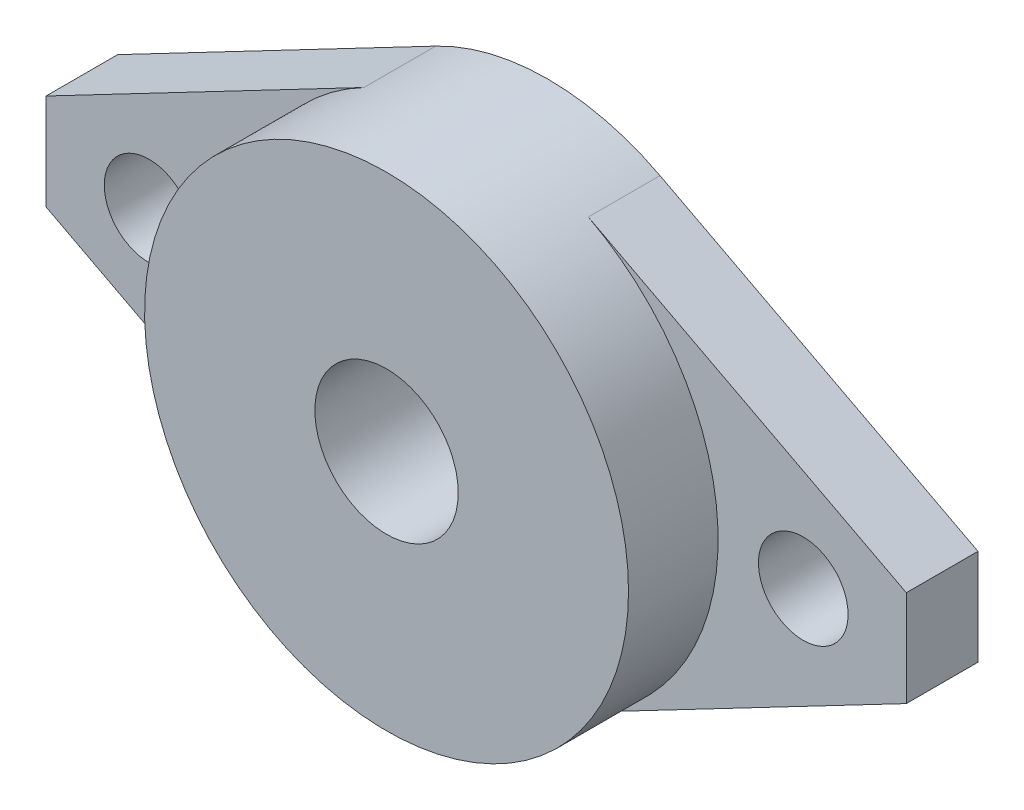
ISO-10303-21;
HEADER;
FILE_DESCRIPTION(('STEP AP214'),'2;1');
FILE_NAME('part.step','',(''),(''),'','','');
FILE_SCHEMA(('AUTOMOTIVE_DESIGN { 1 0 10303 214 1 1 1 1 }'));
ENDSEC;
DATA;
#1=APPLICATION_CONTEXT('core data for automotive mechanical design processes');
#2=APPLICATION_PROTOCOL_DEFINITION('international standard','automotive_design',2000,#1);
#3=PRODUCT_CONTEXT('',#1,'mechanical');
#4=PRODUCT('Part','Part','',(#3));
#5=PRODUCT_RELATED_PRODUCT_CATEGORY('part','',(#4));
#6=PRODUCT_DEFINITION_FORMATION('','',#4);
#7=PRODUCT_DEFINITION_CONTEXT('part definition',#1,'design');
#8=PRODUCT_DEFINITION('design','',#6,#7);
#9=PRODUCT_DEFINITION_SHAPE('','',#8);
#10=(LENGTH_UNIT() NAMED_UNIT(*) SI_UNIT(.MILLI.,.METRE.));
#11=(NAMED_UNIT(*) PLANE_ANGLE_UNIT() SI_UNIT($,.RADIAN.));
#12=(NAMED_UNIT(*) SI_UNIT($,.STERADIAN.) SOLID_ANGLE_UNIT());
#13=UNCERTAINTY_MEASURE_WITH_UNIT(LENGTH_MEASURE(1.E-05),#10,'distance_accuracy_value','');
#14=(GEOMETRIC_REPRESENTATION_CONTEXT(3) GLOBAL_UNCERTAINTY_ASSIGNED_CONTEXT((#13)) GLOBAL_UNIT_ASSIGNED_CONTEXT((#10,
#11,#12)) REPRESENTATION_CONTEXT('',''));
#15=CARTESIAN_POINT('',(0.,0.,0.));
#16=DIRECTION('',(0.,0.,1.));
#17=DIRECTION('',(1.,0.,0.));
#18=AXIS2_PLACEMENT_3D('',#15,#16,#17);
#19=CARTESIAN_POINT('',(0.,0.,4.));
#20=DIRECTION('',(0.,0.,1.));
#21=DIRECTION('',(1.,0.,0.));
#22=AXIS2_PLACEMENT_3D('',#19,#20,#21);
#23=PLANE('',#22);
#24=CARTESIAN_POINT('',(0.,0.,4.));
#25=DIRECTION('',(0.,0.,1.));
#26=DIRECTION('',(1.,0.,0.));
#27=AXIS2_PLACEMENT_3D('',#24,#25,#26);
#28=CIRCLE('',#27,13.5);
#29=CARTESIAN_POINT('',(-6.25875904766189,11.9615189329496,4.));
#30=VERTEX_POINT('',#29);
#31=CARTESIAN_POINT('',(-6.25875904766188,-11.9615189329496,4.));
#32=VERTEX_POINT('',#31);
#33=EDGE_CURVE('E11',#30,#32,#28,.T.);
#34=ORIENTED_EDGE('',*,*,#33,.F.);
#35=DIRECTION('',(-0.886038439477744,-0.463611781308288,0.));
#36=VECTOR('',#35,1.);
#37=CARTESIAN_POINT('',(-24.,2.67857142857141,4.));
#38=LINE('',#37,#36);
#39=CARTESIAN_POINT('',(-24.,2.67857142857141,4.));
#40=VERTEX_POINT('',#39);
#41=EDGE_CURVE('E176',#30,#40,#38,.T.);
#42=ORIENTED_EDGE('',*,*,#41,.T.);
#43=DIRECTION('',(0.,-1.,0.));
#44=VECTOR('',#43,1.);
#45=CARTESIAN_POINT('',(-24.,2.67857142857141,4.));
#46=LINE('',#45,#44);
#47=CARTESIAN_POINT('',(-24.,-2.67857142857141,4.));
#48=VERTEX_POINT('',#47);
#49=EDGE_CURVE('E129',#40,#48,#46,.T.);
#50=ORIENTED_EDGE('',*,*,#49,.T.);
#51=DIRECTION('',(0.886038439477744,-0.463611781308288,0.));
#52=VECTOR('',#51,1.);
#53=CARTESIAN_POINT('',(-6.25875904766188,-11.9615189329496,4.));
#54=LINE('',#53,#52);
#55=EDGE_CURVE('E125',#48,#32,#54,.T.);
#56=ORIENTED_EDGE('',*,*,#55,.T.);
#57=EDGE_LOOP('',(#34,#42,#50,#56));
#58=FACE_BOUND('',#57,.T.);
#59=CARTESIAN_POINT('',(-18.25,0.,4.));
#60=DIRECTION('',(0.,0.,1.));
#61=DIRECTION('',(-1.,0.,0.));
#62=AXIS2_PLACEMENT_3D('',#59,#60,#61);
#63=CIRCLE('',#62,2.5);
#64=CARTESIAN_POINT('',(-20.75,0.,4.));
#65=VERTEX_POINT('',#64);
#66=EDGE_CURVE('E183',#65,#65,#63,.T.);
#67=ORIENTED_EDGE('',*,*,#66,.F.);
#68=EDGE_LOOP('',(#67));
#69=FACE_BOUND('',#68,.T.);
#70=ADVANCED_FACE('F33',(#58,#69),#23,.T.);
#71=CARTESIAN_POINT('',(6.25875904766189,-11.9615189329496,4.));
#72=VERTEX_POINT('',#71);
#73=CARTESIAN_POINT('',(6.25875904766189,11.9615189329495,4.));
#74=VERTEX_POINT('',#73);
#75=EDGE_CURVE('E43',#72,#74,#28,.T.);
#76=ORIENTED_EDGE('',*,*,#75,.F.);
#77=DIRECTION('',(0.886038439477744,0.463611781308288,0.));
#78=VECTOR('',#77,1.);
#79=CARTESIAN_POINT('',(24.,-2.67857142857141,4.));
#80=LINE('',#79,#78);
#81=CARTESIAN_POINT('',(24.,-2.67857142857141,4.));
#82=VERTEX_POINT('',#81);
#83=EDGE_CURVE('E110',#72,#82,#80,.T.);
#84=ORIENTED_EDGE('',*,*,#83,.T.);
#85=DIRECTION('',(0.,1.,0.));
#86=VECTOR('',#85,1.);
#87=CARTESIAN_POINT('',(24.,2.67857142857141,4.));
#88=LINE('',#87,#86);
#89=CARTESIAN_POINT('',(24.,2.67857142857141,4.));
#90=VERTEX_POINT('',#89);
#91=EDGE_CURVE('E52',#82,#90,#88,.T.);
#92=ORIENTED_EDGE('',*,*,#91,.T.);
#93=DIRECTION('',(-0.886038439477744,0.463611781308288,0.));
#94=VECTOR('',#93,1.);
#95=CARTESIAN_POINT('',(6.25875904766188,11.9615189329496,4.));
#96=LINE('',#95,#94);
#97=EDGE_CURVE('E112',#90,#74,#96,.T.);
#98=ORIENTED_EDGE('',*,*,#97,.T.);
#99=EDGE_LOOP('',(#76,#84,#92,#98));
#100=FACE_BOUND('',#99,.T.);
#101=CARTESIAN_POINT('',(18.25,0.,4.));
#102=DIRECTION('',(0.,0.,1.));
#103=DIRECTION('',(1.,0.,0.));
#104=AXIS2_PLACEMENT_3D('',#101,#102,#103);
#105=CIRCLE('',#104,2.5);
#106=CARTESIAN_POINT('',(20.75,0.,4.));
#107=VERTEX_POINT('',#106);
#108=EDGE_CURVE('E137',#107,#107,#105,.T.);
#109=ORIENTED_EDGE('',*,*,#108,.F.);
#110=EDGE_LOOP('',(#109));
#111=FACE_BOUND('',#110,.T.);
#112=ADVANCED_FACE('F107',(#100,#111),#23,.T.);
#113=CARTESIAN_POINT('',(0.,0.,0.));
#114=DIRECTION('',(0.,0.,1.));
#115=DIRECTION('',(1.,0.,0.));
#116=AXIS2_PLACEMENT_3D('',#113,#114,#115);
#117=PLANE('',#116);
#118=DIRECTION('',(-0.886038439477744,0.463611781308288,0.));
#119=VECTOR('',#118,1.);
#120=CARTESIAN_POINT('',(6.25875904766188,11.9615189329496,0.));
#121=LINE('',#120,#119);
#122=CARTESIAN_POINT('',(24.,2.67857142857141,0.));
#123=VERTEX_POINT('',#122);
#124=CARTESIAN_POINT('',(6.25875904766188,11.9615189329496,0.));
#125=VERTEX_POINT('',#124);
#126=EDGE_CURVE('E133',#123,#125,#121,.T.);
#127=ORIENTED_EDGE('',*,*,#126,.F.);
#128=DIRECTION('',(0.,1.,0.));
#129=VECTOR('',#128,1.);
#130=CARTESIAN_POINT('',(24.,2.67857142857141,0.));
#131=LINE('',#130,#129);
#132=CARTESIAN_POINT('',(24.,-2.67857142857141,0.));
#133=VERTEX_POINT('',#132);
#134=EDGE_CURVE('E88',#133,#123,#131,.T.);
#135=ORIENTED_EDGE('',*,*,#134,.F.);
#136=DIRECTION('',(0.886038439477744,0.463611781308288,0.));
#137=VECTOR('',#136,1.);
#138=CARTESIAN_POINT('',(24.,-2.67857142857141,0.));
#139=LINE('',#138,#137);
#140=CARTESIAN_POINT('',(6.25875904766189,-11.9615189329496,0.));
#141=VERTEX_POINT('',#140);
#142=EDGE_CURVE('E82',#141,#133,#139,.T.);
#143=ORIENTED_EDGE('',*,*,#142,.F.);
#144=CARTESIAN_POINT('',(0.,0.,0.));
#145=DIRECTION('',(0.,0.,1.));
#146=DIRECTION('',(1.,0.,0.));
#147=AXIS2_PLACEMENT_3D('',#144,#145,#146);
#148=CIRCLE('',#147,13.5);
#149=CARTESIAN_POINT('',(-6.25875904766188,-11.9615189329496,0.));
#150=VERTEX_POINT('',#149);
#151=EDGE_CURVE('E120',#150,#141,#148,.T.);
#152=ORIENTED_EDGE('',*,*,#151,.F.);
#153=DIRECTION('',(0.886038439477744,-0.463611781308288,0.));
#154=VECTOR('',#153,1.);
#155=CARTESIAN_POINT('',(-6.25875904766188,-11.9615189329496,0.));
#156=LINE('',#155,#154);
#157=CARTESIAN_POINT('',(-24.,-2.67857142857141,0.));
#158=VERTEX_POINT('',#157);
#159=EDGE_CURVE('E143',#158,#150,#156,.T.);
#160=ORIENTED_EDGE('',*,*,#159,.F.);
#161=DIRECTION('',(0.,-1.,0.));
#162=VECTOR('',#161,1.);
#163=CARTESIAN_POINT('',(-24.,2.67857142857141,0.));
#164=LINE('',#163,#162);
#165=CARTESIAN_POINT('',(-24.,2.67857142857141,0.));
#166=VERTEX_POINT('',#165);
#167=EDGE_CURVE('E141',#166,#158,#164,.T.);
#168=ORIENTED_EDGE('',*,*,#167,.F.);
#169=DIRECTION('',(-0.886038439477744,-0.463611781308288,0.));
#170=VECTOR('',#169,1.);
#171=CARTESIAN_POINT('',(-24.,2.67857142857141,0.));
#172=LINE('',#171,#170);
#173=CARTESIAN_POINT('',(-6.25875904766189,11.9615189329496,0.));
#174=VERTEX_POINT('',#173);
#175=EDGE_CURVE('E139',#174,#166,#172,.T.);
#176=ORIENTED_EDGE('',*,*,#175,.F.);
#177=CARTESIAN_POINT('',(0.,0.,0.));
#178=DIRECTION('',(0.,0.,1.));
#179=DIRECTION('',(1.,0.,0.));
#180=AXIS2_PLACEMENT_3D('',#177,#178,#179);
#181=CIRCLE('',#180,13.5);
#182=EDGE_CURVE('E136',#125,#174,#181,.T.);
#183=ORIENTED_EDGE('',*,*,#182,.F.);
#184=EDGE_LOOP('',(#127,#135,#143,#152,#160,#168,#176,#183));
#185=FACE_BOUND('',#184,.T.);
#186=CARTESIAN_POINT('',(18.25,0.,0.));
#187=DIRECTION('',(0.,0.,1.));
#188=DIRECTION('',(1.,0.,0.));
#189=AXIS2_PLACEMENT_3D('',#186,#187,#188);
#190=CIRCLE('',#189,2.5);
#191=CARTESIAN_POINT('',(20.75,0.,0.));
#192=VERTEX_POINT('',#191);
#193=EDGE_CURVE('E180',#192,#192,#190,.T.);
#194=ORIENTED_EDGE('',*,*,#193,.T.);
#195=EDGE_LOOP('',(#194));
#196=FACE_BOUND('',#195,.T.);
#197=CARTESIAN_POINT('',(-18.25,0.,0.));
#198=DIRECTION('',(0.,0.,1.));
#199=DIRECTION('',(-1.,0.,0.));
#200=AXIS2_PLACEMENT_3D('',#197,#198,#199);
#201=CIRCLE('',#200,2.5);
#202=CARTESIAN_POINT('',(-20.75,0.,0.));
#203=VERTEX_POINT('',#202);
#204=EDGE_CURVE('E186',#203,#203,#201,.T.);
#205=ORIENTED_EDGE('',*,*,#204,.T.);
#206=EDGE_LOOP('',(#205));
#207=FACE_BOUND('',#206,.T.);
#208=CARTESIAN_POINT('',(0.,0.,0.));
#209=DIRECTION('',(0.,0.,1.));
#210=DIRECTION('',(1.,0.,0.));
#211=AXIS2_PLACEMENT_3D('',#208,#209,#210);
#212=CIRCLE('',#211,4.);
#213=CARTESIAN_POINT('',(4.,0.,0.));
#214=VERTEX_POINT('',#213);
#215=EDGE_CURVE('E189',#214,#214,#212,.T.);
#216=ORIENTED_EDGE('',*,*,#215,.T.);
#217=EDGE_LOOP('',(#216));
#218=FACE_BOUND('',#217,.T.);
#219=ADVANCED_FACE('F165',(#185,#196,#207,#218),#117,.F.);
#220=CARTESIAN_POINT('',(6.25875904766188,11.9615189329496,4.));
#221=DIRECTION('',(-0.463611781308288,-0.886038439477744,0.));
#222=DIRECTION('',(0.886038439477744,-0.463611781308288,0.));
#223=AXIS2_PLACEMENT_3D('',#220,#221,#222);
#224=PLANE('',#223);
#225=ORIENTED_EDGE('',*,*,#126,.T.);
#226=DIRECTION('',(0.,0.,-1.));
#227=VECTOR('',#226,1.);
#228=CARTESIAN_POINT('',(6.25875904766188,11.9615189329496,4.));
#229=LINE('',#228,#227);
#230=EDGE_CURVE('E37',#74,#125,#229,.T.);
#231=ORIENTED_EDGE('',*,*,#230,.F.);
#232=ORIENTED_EDGE('',*,*,#97,.F.);
#233=DIRECTION('',(0.,0.,-1.));
#234=VECTOR('',#233,1.);
#235=CARTESIAN_POINT('',(24.,2.67857142857141,4.));
#236=LINE('',#235,#234);
#237=EDGE_CURVE('E127',#90,#123,#236,.T.);
#238=ORIENTED_EDGE('',*,*,#237,.T.);
#239=EDGE_LOOP('',(#225,#231,#232,#238));
#240=FACE_BOUND('',#239,.T.);
#241=ADVANCED_FACE('F35',(#240),#224,.F.);
#242=CARTESIAN_POINT('',(-24.,2.67857142857141,4.));
#243=DIRECTION('',(0.463611781308288,-0.886038439477744,0.));
#244=DIRECTION('',(0.886038439477744,0.463611781308288,0.));
#245=AXIS2_PLACEMENT_3D('',#242,#243,#244);
#246=PLANE('',#245);
#247=ORIENTED_EDGE('',*,*,#175,.T.);
#248=DIRECTION('',(0.,0.,-1.));
#249=VECTOR('',#248,1.);
#250=CARTESIAN_POINT('',(-24.,2.67857142857141,4.));
#251=LINE('',#250,#249);
#252=EDGE_CURVE('E154',#40,#166,#251,.T.);
#253=ORIENTED_EDGE('',*,*,#252,.F.);
#254=ORIENTED_EDGE('',*,*,#41,.F.);
#255=DIRECTION('',(0.,0.,-1.));
#256=VECTOR('',#255,1.);
#257=CARTESIAN_POINT('',(-6.25875904766189,11.9615189329496,4.));
#258=LINE('',#257,#256);
#259=EDGE_CURVE('E156',#30,#174,#258,.T.);
#260=ORIENTED_EDGE('',*,*,#259,.T.);
#261=EDGE_LOOP('',(#247,#253,#254,#260));
#262=FACE_BOUND('',#261,.T.);
#263=ADVANCED_FACE('F170',(#262),#246,.F.);
#264=CARTESIAN_POINT('',(-24.,2.67857142857141,4.));
#265=DIRECTION('',(1.,0.,0.));
#266=DIRECTION('',(0.,0.,-1.));
#267=AXIS2_PLACEMENT_3D('',#264,#265,#266);
#268=PLANE('',#267);
#269=ORIENTED_EDGE('',*,*,#167,.T.);
#270=DIRECTION('',(0.,0.,-1.));
#271=VECTOR('',#270,1.);
#272=CARTESIAN_POINT('',(-24.,-2.67857142857141,4.));
#273=LINE('',#272,#271);
#274=EDGE_CURVE('E151',#48,#158,#273,.T.);
#275=ORIENTED_EDGE('',*,*,#274,.F.);
#276=ORIENTED_EDGE('',*,*,#49,.F.);
#277=ORIENTED_EDGE('',*,*,#252,.T.);
#278=EDGE_LOOP('',(#269,#275,#276,#277));
#279=FACE_BOUND('',#278,.T.);
#280=ADVANCED_FACE('F173',(#279),#268,.F.);
#281=CARTESIAN_POINT('',(-6.25875904766188,-11.9615189329496,4.));
#282=DIRECTION('',(0.463611781308288,0.886038439477744,0.));
#283=DIRECTION('',(-0.886038439477744,0.463611781308288,0.));
#284=AXIS2_PLACEMENT_3D('',#281,#282,#283);
#285=PLANE('',#284);
#286=ORIENTED_EDGE('',*,*,#159,.T.);
#287=DIRECTION('',(0.,0.,-1.));
#288=VECTOR('',#287,1.);
#289=CARTESIAN_POINT('',(-6.25875904766188,-11.9615189329496,4.));
#290=LINE('',#289,#288);
#291=EDGE_CURVE('E121',#32,#150,#290,.T.);
#292=ORIENTED_EDGE('',*,*,#291,.F.);
#293=ORIENTED_EDGE('',*,*,#55,.F.);
#294=ORIENTED_EDGE('',*,*,#274,.T.);
#295=EDGE_LOOP('',(#286,#292,#293,#294));
#296=FACE_BOUND('',#295,.T.);
#297=ADVANCED_FACE('F232',(#296),#285,.F.);
#298=CARTESIAN_POINT('',(0.,0.,4.));
#299=DIRECTION('',(0.,0.,-1.));
#300=DIRECTION('',(-1.,0.,0.));
#301=AXIS2_PLACEMENT_3D('',#298,#299,#300);
#302=CYLINDRICAL_SURFACE('',#301,13.5);
#303=ORIENTED_EDGE('',*,*,#151,.T.);
#304=DIRECTION('',(0.,0.,-1.));
#305=VECTOR('',#304,1.);
#306=CARTESIAN_POINT('',(6.25875904766189,-11.9615189329496,4.));
#307=LINE('',#306,#305);
#308=EDGE_CURVE('E115',#72,#141,#307,.T.);
#309=ORIENTED_EDGE('',*,*,#308,.F.);
#310=ORIENTED_EDGE('',*,*,#75,.T.);
#311=ORIENTED_EDGE('',*,*,#230,.T.);
#312=ORIENTED_EDGE('',*,*,#182,.T.);
#313=ORIENTED_EDGE('',*,*,#259,.F.);
#314=ORIENTED_EDGE('',*,*,#33,.T.);
#315=ORIENTED_EDGE('',*,*,#291,.T.);
#316=EDGE_LOOP('',(#303,#309,#310,#311,#312,#313,#314,#315));
#317=FACE_BOUND('',#316,.T.);
#318=CARTESIAN_POINT('',(0.,0.,9.));
#319=DIRECTION('',(0.,0.,1.));
#320=DIRECTION('',(1.,0.,0.));
#321=AXIS2_PLACEMENT_3D('',#318,#319,#320);
#322=CIRCLE('',#321,13.5);
#323=CARTESIAN_POINT('',(13.5,0.,9.));
#324=VERTEX_POINT('',#323);
#325=EDGE_CURVE('E193',#324,#324,#322,.T.);
#326=ORIENTED_EDGE('',*,*,#325,.F.);
#327=EDGE_LOOP('',(#326));
#328=FACE_BOUND('',#327,.T.);
#329=ADVANCED_FACE('F116',(#317,#328),#302,.T.);
#330=CARTESIAN_POINT('',(24.,-2.67857142857141,4.));
#331=DIRECTION('',(-0.463611781308288,0.886038439477744,0.));
#332=DIRECTION('',(-0.886038439477744,-0.463611781308288,0.));
#333=AXIS2_PLACEMENT_3D('',#330,#331,#332);
#334=PLANE('',#333);
#335=ORIENTED_EDGE('',*,*,#142,.T.);
#336=DIRECTION('',(0.,0.,-1.));
#337=VECTOR('',#336,1.);
#338=CARTESIAN_POINT('',(24.,-2.67857142857141,4.));
#339=LINE('',#338,#337);
#340=EDGE_CURVE('E122',#82,#133,#339,.T.);
#341=ORIENTED_EDGE('',*,*,#340,.F.);
#342=ORIENTED_EDGE('',*,*,#83,.F.);
#343=ORIENTED_EDGE('',*,*,#308,.T.);
#344=EDGE_LOOP('',(#335,#341,#342,#343));
#345=FACE_BOUND('',#344,.T.);
#346=ADVANCED_FACE('F124',(#345),#334,.F.);
#347=CARTESIAN_POINT('',(24.,2.67857142857141,4.));
#348=DIRECTION('',(-1.,0.,0.));
#349=DIRECTION('',(0.,0.,1.));
#350=AXIS2_PLACEMENT_3D('',#347,#348,#349);
#351=PLANE('',#350);
#352=ORIENTED_EDGE('',*,*,#134,.T.);
#353=ORIENTED_EDGE('',*,*,#237,.F.);
#354=ORIENTED_EDGE('',*,*,#91,.F.);
#355=ORIENTED_EDGE('',*,*,#340,.T.);
#356=EDGE_LOOP('',(#352,#353,#354,#355));
#357=FACE_BOUND('',#356,.T.);
#358=ADVANCED_FACE('F225',(#357),#351,.F.);
#359=CARTESIAN_POINT('',(18.25,0.,4.));
#360=DIRECTION('',(0.,0.,-1.));
#361=DIRECTION('',(-1.,0.,0.));
#362=AXIS2_PLACEMENT_3D('',#359,#360,#361);
#363=CYLINDRICAL_SURFACE('',#362,2.5);
#364=ORIENTED_EDGE('',*,*,#108,.T.);
#365=EDGE_LOOP('',(#364));
#366=FACE_BOUND('',#365,.T.);
#367=ORIENTED_EDGE('',*,*,#193,.F.);
#368=EDGE_LOOP('',(#367));
#369=FACE_BOUND('',#368,.T.);
#370=ADVANCED_FACE('F221',(#366,#369),#363,.F.);
#371=CARTESIAN_POINT('',(-18.25,0.,4.));
#372=DIRECTION('',(0.,0.,-1.));
#373=DIRECTION('',(-1.,0.,0.));
#374=AXIS2_PLACEMENT_3D('',#371,#372,#373);
#375=CYLINDRICAL_SURFACE('',#374,2.5);
#376=ORIENTED_EDGE('',*,*,#66,.T.);
#377=EDGE_LOOP('',(#376));
#378=FACE_BOUND('',#377,.T.);
#379=ORIENTED_EDGE('',*,*,#204,.F.);
#380=EDGE_LOOP('',(#379));
#381=FACE_BOUND('',#380,.T.);
#382=ADVANCED_FACE('F210',(#378,#381),#375,.F.);
#383=CARTESIAN_POINT('',(0.,0.,4.));
#384=DIRECTION('',(0.,0.,-1.));
#385=DIRECTION('',(-1.,0.,0.));
#386=AXIS2_PLACEMENT_3D('',#383,#384,#385);
#387=CYLINDRICAL_SURFACE('',#386,4.);
#388=ORIENTED_EDGE('',*,*,#215,.F.);
#389=EDGE_LOOP('',(#388));
#390=FACE_BOUND('',#389,.T.);
#391=CARTESIAN_POINT('',(0.,0.,9.));
#392=DIRECTION('',(0.,0.,1.));
#393=DIRECTION('',(1.,0.,0.));
#394=AXIS2_PLACEMENT_3D('',#391,#392,#393);
#395=CIRCLE('',#394,4.);
#396=CARTESIAN_POINT('',(4.,0.,9.));
#397=VERTEX_POINT('',#396);
#398=EDGE_CURVE('E197',#397,#397,#395,.T.);
#399=ORIENTED_EDGE('',*,*,#398,.T.);
#400=EDGE_LOOP('',(#399));
#401=FACE_BOUND('',#400,.T.);
#402=ADVANCED_FACE('F201',(#390,#401),#387,.F.);
#403=CARTESIAN_POINT('',(0.,0.,9.));
#404=DIRECTION('',(0.,0.,1.));
#405=DIRECTION('',(1.,0.,0.));
#406=AXIS2_PLACEMENT_3D('',#403,#404,#405);
#407=PLANE('',#406);
#408=ORIENTED_EDGE('',*,*,#325,.T.);
#409=EDGE_LOOP('',(#408));
#410=FACE_BOUND('',#409,.T.);
#411=ORIENTED_EDGE('',*,*,#398,.F.);
#412=EDGE_LOOP('',(#411));
#413=FACE_BOUND('',#412,.T.);
#414=ADVANCED_FACE('F203',(#410,#413),#407,.T.);
#415=CLOSED_SHELL('',(#70,#112,#219,#241,#263,#280,#297,#329,#346,#358,#370,#382,#402,#414));
#416=MANIFOLD_SOLID_BREP('B2',#415);
#417=ADVANCED_BREP_SHAPE_REPRESENTATION('',(#18,#416),#14);
#418=SHAPE_DEFINITION_REPRESENTATION(#9,#417);
ENDSEC;
END-ISO-10303-21;
